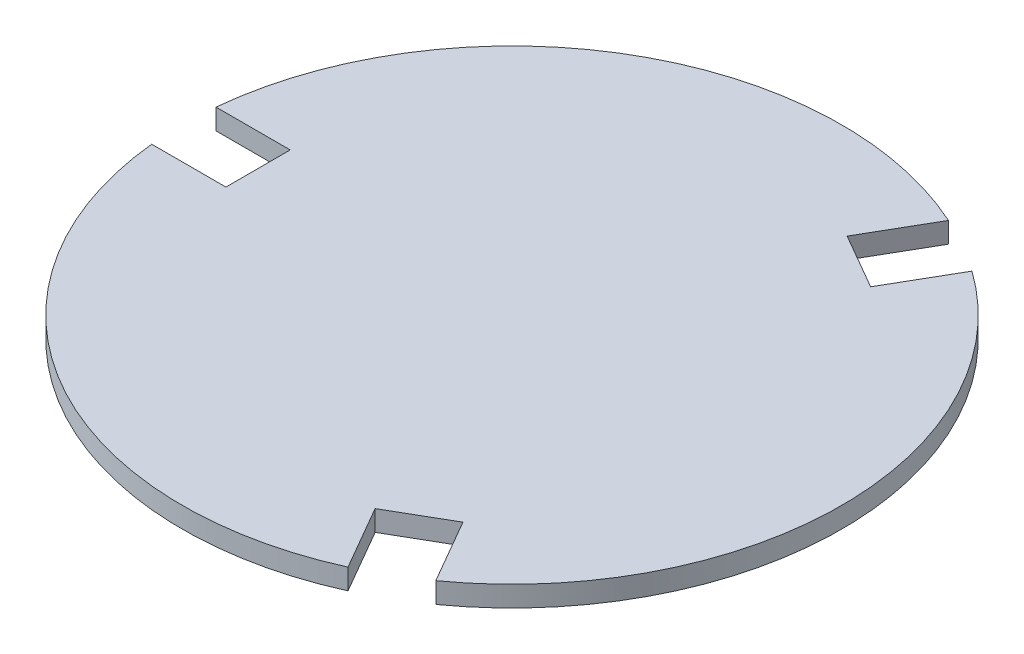
ISO-10303-21;
HEADER;
FILE_DESCRIPTION(('STEP AP214'),'2;1');
FILE_NAME('part.step','',(''),(''),'','','');
FILE_SCHEMA(('AUTOMOTIVE_DESIGN { 1 0 10303 214 1 1 1 1 }'));
ENDSEC;
DATA;
#1=APPLICATION_CONTEXT('core data for automotive mechanical design processes');
#2=APPLICATION_PROTOCOL_DEFINITION('international standard','automotive_design',2000,#1);
#3=PRODUCT_CONTEXT('',#1,'mechanical');
#4=PRODUCT('Part','Part','',(#3));
#5=PRODUCT_RELATED_PRODUCT_CATEGORY('part','',(#4));
#6=PRODUCT_DEFINITION_FORMATION('','',#4);
#7=PRODUCT_DEFINITION_CONTEXT('part definition',#1,'design');
#8=PRODUCT_DEFINITION('design','',#6,#7);
#9=PRODUCT_DEFINITION_SHAPE('','',#8);
#10=(LENGTH_UNIT() NAMED_UNIT(*) SI_UNIT(.MILLI.,.METRE.));
#11=(NAMED_UNIT(*) PLANE_ANGLE_UNIT() SI_UNIT($,.RADIAN.));
#12=(NAMED_UNIT(*) SI_UNIT($,.STERADIAN.) SOLID_ANGLE_UNIT());
#13=UNCERTAINTY_MEASURE_WITH_UNIT(LENGTH_MEASURE(1.E-05),#10,'distance_accuracy_value','');
#14=(GEOMETRIC_REPRESENTATION_CONTEXT(3) GLOBAL_UNCERTAINTY_ASSIGNED_CONTEXT((#13)) GLOBAL_UNIT_ASSIGNED_CONTEXT((#10,
#11,#12)) REPRESENTATION_CONTEXT('',''));
#15=CARTESIAN_POINT('',(0.,0.,0.));
#16=DIRECTION('',(0.,0.,1.));
#17=DIRECTION('',(1.,0.,0.));
#18=AXIS2_PLACEMENT_3D('',#15,#16,#17);
#19=CARTESIAN_POINT('',(0.,3.175,0.));
#20=DIRECTION('',(0.,-1.,0.));
#21=DIRECTION('',(0.,0.,-1.));
#22=AXIS2_PLACEMENT_3D('',#19,#20,#21);
#23=CYLINDRICAL_SURFACE('',#22,50.8);
#24=CARTESIAN_POINT('',(0.,0.,0.));
#25=DIRECTION('',(0.,1.,0.));
#26=DIRECTION('',(0.,0.,1.));
#27=AXIS2_PLACEMENT_3D('',#24,#25,#26);
#28=CIRCLE('',#27,50.8);
#29=CARTESIAN_POINT('',(-50.5579646643336,0.,4.953));
#30=VERTEX_POINT('',#29);
#31=CARTESIAN_POINT('',(20.9895585072227,0.,46.2609817629488));
#32=VERTEX_POINT('',#31);
#33=EDGE_CURVE('E209',#30,#32,#28,.T.);
#34=ORIENTED_EDGE('',*,*,#33,.T.);
#35=DIRECTION('',(0.,-1.,0.));
#36=VECTOR('',#35,1.);
#37=CARTESIAN_POINT('',(20.9895585072227,3.175,46.2609817629488));
#38=LINE('',#37,#36);
#39=CARTESIAN_POINT('',(20.9895585072227,3.175,46.2609817629488));
#40=VERTEX_POINT('',#39);
#41=EDGE_CURVE('E130',#32,#40,#38,.F.);
#42=ORIENTED_EDGE('',*,*,#41,.T.);
#43=CARTESIAN_POINT('',(0.,3.175,0.));
#44=DIRECTION('',(0.,1.,0.));
#45=DIRECTION('',(0.,0.,1.));
#46=AXIS2_PLACEMENT_3D('',#43,#44,#45);
#47=CIRCLE('',#46,50.8);
#48=CARTESIAN_POINT('',(-50.5579646643335,3.175,4.953));
#49=VERTEX_POINT('',#48);
#50=EDGE_CURVE('E203',#49,#40,#47,.T.);
#51=ORIENTED_EDGE('',*,*,#50,.F.);
#52=DIRECTION('',(0.,-1.,0.));
#53=VECTOR('',#52,1.);
#54=CARTESIAN_POINT('',(-50.5579646643336,3.175,4.953));
#55=LINE('',#54,#53);
#56=EDGE_CURVE('E194',#49,#30,#55,.T.);
#57=ORIENTED_EDGE('',*,*,#56,.T.);
#58=EDGE_LOOP('',(#34,#42,#51,#57));
#59=FACE_BOUND('',#58,.T.);
#60=ADVANCED_FACE('F33',(#59),#23,.T.);
#61=CARTESIAN_POINT('',(29.5684061571113,3.175,41.3079817629487));
#62=VERTEX_POINT('',#61);
#63=CARTESIAN_POINT('',(29.5684061571113,3.175,-41.3079817629487));
#64=VERTEX_POINT('',#63);
#65=EDGE_CURVE('E207',#62,#64,#47,.T.);
#66=ORIENTED_EDGE('',*,*,#65,.F.);
#67=DIRECTION('',(0.,-1.,0.));
#68=VECTOR('',#67,1.);
#69=CARTESIAN_POINT('',(29.5684061571113,3.175,41.3079817629487));
#70=LINE('',#69,#68);
#71=CARTESIAN_POINT('',(29.5684061571113,0.,41.3079817629487));
#72=VERTEX_POINT('',#71);
#73=EDGE_CURVE('E140',#62,#72,#70,.T.);
#74=ORIENTED_EDGE('',*,*,#73,.T.);
#75=CARTESIAN_POINT('',(29.5684061571113,0.,-41.3079817629487));
#76=VERTEX_POINT('',#75);
#77=EDGE_CURVE('E211',#72,#76,#28,.T.);
#78=ORIENTED_EDGE('',*,*,#77,.T.);
#79=DIRECTION('',(0.,-1.,0.));
#80=VECTOR('',#79,1.);
#81=CARTESIAN_POINT('',(29.5684061571113,3.175,-41.3079817629487));
#82=LINE('',#81,#80);
#83=EDGE_CURVE('E174',#76,#64,#82,.F.);
#84=ORIENTED_EDGE('',*,*,#83,.T.);
#85=EDGE_LOOP('',(#66,#74,#78,#84));
#86=FACE_BOUND('',#85,.T.);
#87=ADVANCED_FACE('F232',(#86),#23,.T.);
#88=CARTESIAN_POINT('',(20.9895585072227,3.175,-46.2609817629488));
#89=VERTEX_POINT('',#88);
#90=CARTESIAN_POINT('',(-50.5579646643336,3.175,-4.953));
#91=VERTEX_POINT('',#90);
#92=EDGE_CURVE('E208',#89,#91,#47,.T.);
#93=ORIENTED_EDGE('',*,*,#92,.F.);
#94=DIRECTION('',(0.,-1.,0.));
#95=VECTOR('',#94,1.);
#96=CARTESIAN_POINT('',(20.9895585072227,3.175,-46.2609817629487));
#97=LINE('',#96,#95);
#98=CARTESIAN_POINT('',(20.9895585072227,0.,-46.2609817629488));
#99=VERTEX_POINT('',#98);
#100=EDGE_CURVE('E170',#89,#99,#97,.T.);
#101=ORIENTED_EDGE('',*,*,#100,.T.);
#102=CARTESIAN_POINT('',(-50.5579646643336,0.,-4.953));
#103=VERTEX_POINT('',#102);
#104=EDGE_CURVE('E202',#99,#103,#28,.T.);
#105=ORIENTED_EDGE('',*,*,#104,.T.);
#106=DIRECTION('',(0.,-1.,0.));
#107=VECTOR('',#106,1.);
#108=CARTESIAN_POINT('',(-50.5579646643336,3.175,-4.953));
#109=LINE('',#108,#107);
#110=EDGE_CURVE('E199',#103,#91,#109,.F.);
#111=ORIENTED_EDGE('',*,*,#110,.T.);
#112=EDGE_LOOP('',(#93,#101,#105,#111));
#113=FACE_BOUND('',#112,.T.);
#114=ADVANCED_FACE('F35',(#113),#23,.T.);
#115=CARTESIAN_POINT('',(0.,3.175,0.));
#116=DIRECTION('',(0.,1.,0.));
#117=DIRECTION('',(0.,0.,1.));
#118=AXIS2_PLACEMENT_3D('',#115,#116,#117);
#119=PLANE('',#118);
#120=DIRECTION('',(0.500000000000004,0.,0.866025403784436));
#121=VECTOR('',#120,1.);
#122=CARTESIAN_POINT('',(20.9895585072227,3.175,46.2609817629488));
#123=LINE('',#122,#121);
#124=CARTESIAN_POINT('',(15.2745585072226,3.175,36.3623113976926));
#125=VERTEX_POINT('',#124);
#126=EDGE_CURVE('E134',#125,#40,#123,.T.);
#127=ORIENTED_EDGE('',*,*,#126,.F.);
#128=DIRECTION('',(-0.866025403784436,0.,0.500000000000004));
#129=VECTOR('',#128,1.);
#130=CARTESIAN_POINT('',(15.2745585072226,3.175,36.3623113976926));
#131=LINE('',#130,#129);
#132=CARTESIAN_POINT('',(23.8534061571112,3.175,31.4093113976926));
#133=VERTEX_POINT('',#132);
#134=EDGE_CURVE('E138',#133,#125,#131,.T.);
#135=ORIENTED_EDGE('',*,*,#134,.F.);
#136=DIRECTION('',(-0.500000000000004,0.,-0.866025403784436));
#137=VECTOR('',#136,1.);
#138=CARTESIAN_POINT('',(23.8534061571112,3.175,31.4093113976926));
#139=LINE('',#138,#137);
#140=EDGE_CURVE('E148',#62,#133,#139,.T.);
#141=ORIENTED_EDGE('',*,*,#140,.F.);
#142=ORIENTED_EDGE('',*,*,#65,.T.);
#143=DIRECTION('',(0.500000000000004,0.,-0.866025403784436));
#144=VECTOR('',#143,1.);
#145=CARTESIAN_POINT('',(29.5684061571113,3.175,-41.3079817629487));
#146=LINE('',#145,#144);
#147=CARTESIAN_POINT('',(23.8534061571112,3.175,-31.4093113976926));
#148=VERTEX_POINT('',#147);
#149=EDGE_CURVE('E159',#148,#64,#146,.T.);
#150=ORIENTED_EDGE('',*,*,#149,.F.);
#151=DIRECTION('',(0.866025403784436,0.,0.500000000000004));
#152=VECTOR('',#151,1.);
#153=CARTESIAN_POINT('',(23.8534061571112,3.175,-31.4093113976926));
#154=LINE('',#153,#152);
#155=CARTESIAN_POINT('',(15.2745585072226,3.175,-36.3623113976926));
#156=VERTEX_POINT('',#155);
#157=EDGE_CURVE('E163',#156,#148,#154,.T.);
#158=ORIENTED_EDGE('',*,*,#157,.F.);
#159=DIRECTION('',(-0.500000000000004,0.,0.866025403784436));
#160=VECTOR('',#159,1.);
#161=CARTESIAN_POINT('',(15.2745585072226,3.175,-36.3623113976926));
#162=LINE('',#161,#160);
#163=EDGE_CURVE('E155',#89,#156,#162,.T.);
#164=ORIENTED_EDGE('',*,*,#163,.F.);
#165=ORIENTED_EDGE('',*,*,#92,.T.);
#166=DIRECTION('',(-1.,0.,0.));
#167=VECTOR('',#166,1.);
#168=CARTESIAN_POINT('',(-50.5579646643336,3.175,-4.953));
#169=LINE('',#168,#167);
#170=CARTESIAN_POINT('',(-39.1279646643335,3.175,-4.953));
#171=VERTEX_POINT('',#170);
#172=EDGE_CURVE('E182',#171,#91,#169,.T.);
#173=ORIENTED_EDGE('',*,*,#172,.F.);
#174=DIRECTION('',(0.,0.,-1.));
#175=VECTOR('',#174,1.);
#176=CARTESIAN_POINT('',(-39.1279646643335,3.175,-4.953));
#177=LINE('',#176,#175);
#178=CARTESIAN_POINT('',(-39.1279646643335,3.175,4.953));
#179=VERTEX_POINT('',#178);
#180=EDGE_CURVE('E187',#179,#171,#177,.T.);
#181=ORIENTED_EDGE('',*,*,#180,.F.);
#182=DIRECTION('',(1.,0.,0.));
#183=VECTOR('',#182,1.);
#184=CARTESIAN_POINT('',(-39.1279646643335,3.175,4.953));
#185=LINE('',#184,#183);
#186=EDGE_CURVE('E177',#49,#179,#185,.T.);
#187=ORIENTED_EDGE('',*,*,#186,.F.);
#188=ORIENTED_EDGE('',*,*,#50,.T.);
#189=EDGE_LOOP('',(#127,#135,#141,#142,#150,#158,#164,#165,#173,#181,#187,#188));
#190=FACE_BOUND('',#189,.T.);
#191=ADVANCED_FACE('F226',(#190),#119,.T.);
#192=CARTESIAN_POINT('',(0.,0.,0.));
#193=DIRECTION('',(0.,1.,0.));
#194=DIRECTION('',(0.,0.,1.));
#195=AXIS2_PLACEMENT_3D('',#192,#193,#194);
#196=PLANE('',#195);
#197=DIRECTION('',(-0.866025403784436,0.,0.500000000000004));
#198=VECTOR('',#197,1.);
#199=CARTESIAN_POINT('',(15.2745585072226,0.,36.3623113976926));
#200=LINE('',#199,#198);
#201=CARTESIAN_POINT('',(23.8534061571112,0.,31.4093113976926));
#202=VERTEX_POINT('',#201);
#203=CARTESIAN_POINT('',(15.2745585072226,0.,36.3623113976926));
#204=VERTEX_POINT('',#203);
#205=EDGE_CURVE('E48',#202,#204,#200,.T.);
#206=ORIENTED_EDGE('',*,*,#205,.T.);
#207=DIRECTION('',(0.500000000000004,0.,0.866025403784436));
#208=VECTOR('',#207,1.);
#209=CARTESIAN_POINT('',(20.9895585072227,0.,46.2609817629488));
#210=LINE('',#209,#208);
#211=EDGE_CURVE('E125',#204,#32,#210,.T.);
#212=ORIENTED_EDGE('',*,*,#211,.T.);
#213=ORIENTED_EDGE('',*,*,#33,.F.);
#214=DIRECTION('',(1.,0.,0.));
#215=VECTOR('',#214,1.);
#216=CARTESIAN_POINT('',(0.,0.,4.953));
#217=LINE('',#216,#215);
#218=CARTESIAN_POINT('',(-39.1279646643335,0.,4.953));
#219=VERTEX_POINT('',#218);
#220=EDGE_CURVE('E206',#30,#219,#217,.T.);
#221=ORIENTED_EDGE('',*,*,#220,.T.);
#222=DIRECTION('',(0.,0.,-1.));
#223=VECTOR('',#222,1.);
#224=CARTESIAN_POINT('',(-39.1279646643335,0.,-4.953));
#225=LINE('',#224,#223);
#226=CARTESIAN_POINT('',(-39.1279646643335,0.,-4.953));
#227=VERTEX_POINT('',#226);
#228=EDGE_CURVE('E181',#219,#227,#225,.T.);
#229=ORIENTED_EDGE('',*,*,#228,.T.);
#230=DIRECTION('',(-1.,0.,0.));
#231=VECTOR('',#230,1.);
#232=CARTESIAN_POINT('',(-50.5579646643336,0.,-4.953));
#233=LINE('',#232,#231);
#234=EDGE_CURVE('E178',#227,#103,#233,.T.);
#235=ORIENTED_EDGE('',*,*,#234,.T.);
#236=ORIENTED_EDGE('',*,*,#104,.F.);
#237=DIRECTION('',(-0.500000000000004,0.,0.866025403784436));
#238=VECTOR('',#237,1.);
#239=CARTESIAN_POINT('',(-4.28942382494431,0.,-2.47650000000002));
#240=LINE('',#239,#238);
#241=CARTESIAN_POINT('',(15.2745585072226,0.,-36.3623113976926));
#242=VERTEX_POINT('',#241);
#243=EDGE_CURVE('E41',#99,#242,#240,.T.);
#244=ORIENTED_EDGE('',*,*,#243,.T.);
#245=DIRECTION('',(0.866025403784436,0.,0.500000000000004));
#246=VECTOR('',#245,1.);
#247=CARTESIAN_POINT('',(23.8534061571112,0.,-31.4093113976926));
#248=LINE('',#247,#246);
#249=CARTESIAN_POINT('',(23.8534061571112,0.,-31.4093113976926));
#250=VERTEX_POINT('',#249);
#251=EDGE_CURVE('E56',#242,#250,#248,.T.);
#252=ORIENTED_EDGE('',*,*,#251,.T.);
#253=DIRECTION('',(0.500000000000004,0.,-0.866025403784436));
#254=VECTOR('',#253,1.);
#255=CARTESIAN_POINT('',(29.5684061571113,0.,-41.3079817629487));
#256=LINE('',#255,#254);
#257=EDGE_CURVE('E156',#250,#76,#256,.T.);
#258=ORIENTED_EDGE('',*,*,#257,.T.);
#259=ORIENTED_EDGE('',*,*,#77,.F.);
#260=DIRECTION('',(-0.500000000000004,0.,-0.866025403784436));
#261=VECTOR('',#260,1.);
#262=CARTESIAN_POINT('',(4.28942382494432,0.,-2.47650000000002));
#263=LINE('',#262,#261);
#264=EDGE_CURVE('E11',#72,#202,#263,.T.);
#265=ORIENTED_EDGE('',*,*,#264,.T.);
#266=EDGE_LOOP('',(#206,#212,#213,#221,#229,#235,#236,#244,#252,#258,#259,#265));
#267=FACE_BOUND('',#266,.T.);
#268=ADVANCED_FACE('F143',(#267),#196,.F.);
#269=CARTESIAN_POINT('',(-50.5579646643336,0.,-4.953));
#270=DIRECTION('',(0.,0.,-1.));
#271=DIRECTION('',(-1.,0.,0.));
#272=AXIS2_PLACEMENT_3D('',#269,#270,#271);
#273=PLANE('',#272);
#274=ORIENTED_EDGE('',*,*,#234,.F.);
#275=DIRECTION('',(0.,1.,0.));
#276=VECTOR('',#275,1.);
#277=CARTESIAN_POINT('',(-39.1279646643335,0.,-4.953));
#278=LINE('',#277,#276);
#279=EDGE_CURVE('E192',#227,#171,#278,.T.);
#280=ORIENTED_EDGE('',*,*,#279,.T.);
#281=ORIENTED_EDGE('',*,*,#172,.T.);
#282=ORIENTED_EDGE('',*,*,#110,.F.);
#283=EDGE_LOOP('',(#274,#280,#281,#282));
#284=FACE_BOUND('',#283,.T.);
#285=ADVANCED_FACE('F257',(#284),#273,.F.);
#286=CARTESIAN_POINT('',(-39.1279646643335,0.,4.953));
#287=DIRECTION('',(0.,0.,1.));
#288=DIRECTION('',(1.,0.,0.));
#289=AXIS2_PLACEMENT_3D('',#286,#287,#288);
#290=PLANE('',#289);
#291=ORIENTED_EDGE('',*,*,#186,.T.);
#292=DIRECTION('',(0.,1.,0.));
#293=VECTOR('',#292,1.);
#294=CARTESIAN_POINT('',(-39.1279646643335,0.,4.953));
#295=LINE('',#294,#293);
#296=EDGE_CURVE('E185',#219,#179,#295,.T.);
#297=ORIENTED_EDGE('',*,*,#296,.F.);
#298=ORIENTED_EDGE('',*,*,#220,.F.);
#299=ORIENTED_EDGE('',*,*,#56,.F.);
#300=EDGE_LOOP('',(#291,#297,#298,#299));
#301=FACE_BOUND('',#300,.T.);
#302=ADVANCED_FACE('F259',(#301),#290,.F.);
#303=CARTESIAN_POINT('',(-39.1279646643335,0.,-4.953));
#304=DIRECTION('',(1.,0.,0.));
#305=DIRECTION('',(0.,0.,-1.));
#306=AXIS2_PLACEMENT_3D('',#303,#304,#305);
#307=PLANE('',#306);
#308=ORIENTED_EDGE('',*,*,#180,.T.);
#309=ORIENTED_EDGE('',*,*,#279,.F.);
#310=ORIENTED_EDGE('',*,*,#228,.F.);
#311=ORIENTED_EDGE('',*,*,#296,.T.);
#312=EDGE_LOOP('',(#308,#309,#310,#311));
#313=FACE_BOUND('',#312,.T.);
#314=ADVANCED_FACE('F262',(#313),#307,.F.);
#315=CARTESIAN_POINT('',(29.5684061571113,0.,-41.3079817629487));
#316=DIRECTION('',(0.866025403784436,0.,0.500000000000004));
#317=DIRECTION('',(0.500000000000004,0.,-0.866025403784436));
#318=AXIS2_PLACEMENT_3D('',#315,#316,#317);
#319=PLANE('',#318);
#320=ORIENTED_EDGE('',*,*,#257,.F.);
#321=DIRECTION('',(0.,1.,0.));
#322=VECTOR('',#321,1.);
#323=CARTESIAN_POINT('',(23.8534061571112,0.,-31.4093113976926));
#324=LINE('',#323,#322);
#325=EDGE_CURVE('E168',#250,#148,#324,.T.);
#326=ORIENTED_EDGE('',*,*,#325,.T.);
#327=ORIENTED_EDGE('',*,*,#149,.T.);
#328=ORIENTED_EDGE('',*,*,#83,.F.);
#329=EDGE_LOOP('',(#320,#326,#327,#328));
#330=FACE_BOUND('',#329,.T.);
#331=ADVANCED_FACE('F231',(#330),#319,.F.);
#332=CARTESIAN_POINT('',(15.2745585072226,0.,-36.3623113976926));
#333=DIRECTION('',(-0.866025403784436,0.,-0.500000000000004));
#334=DIRECTION('',(-0.500000000000004,0.,0.866025403784436));
#335=AXIS2_PLACEMENT_3D('',#332,#333,#334);
#336=PLANE('',#335);
#337=ORIENTED_EDGE('',*,*,#163,.T.);
#338=DIRECTION('',(0.,1.,0.));
#339=VECTOR('',#338,1.);
#340=CARTESIAN_POINT('',(15.2745585072226,0.,-36.3623113976926));
#341=LINE('',#340,#339);
#342=EDGE_CURVE('E161',#242,#156,#341,.T.);
#343=ORIENTED_EDGE('',*,*,#342,.F.);
#344=ORIENTED_EDGE('',*,*,#243,.F.);
#345=ORIENTED_EDGE('',*,*,#100,.F.);
#346=EDGE_LOOP('',(#337,#343,#344,#345));
#347=FACE_BOUND('',#346,.T.);
#348=ADVANCED_FACE('F216',(#347),#336,.F.);
#349=CARTESIAN_POINT('',(23.8534061571112,0.,-31.4093113976926));
#350=DIRECTION('',(-0.500000000000004,0.,0.866025403784436));
#351=DIRECTION('',(0.866025403784436,0.,0.500000000000004));
#352=AXIS2_PLACEMENT_3D('',#349,#350,#351);
#353=PLANE('',#352);
#354=ORIENTED_EDGE('',*,*,#157,.T.);
#355=ORIENTED_EDGE('',*,*,#325,.F.);
#356=ORIENTED_EDGE('',*,*,#251,.F.);
#357=ORIENTED_EDGE('',*,*,#342,.T.);
#358=EDGE_LOOP('',(#354,#355,#356,#357));
#359=FACE_BOUND('',#358,.T.);
#360=ADVANCED_FACE('F233',(#359),#353,.F.);
#361=CARTESIAN_POINT('',(20.9895585072227,0.,46.2609817629488));
#362=DIRECTION('',(-0.866025403784436,0.,0.500000000000004));
#363=DIRECTION('',(0.500000000000004,0.,0.866025403784436));
#364=AXIS2_PLACEMENT_3D('',#361,#362,#363);
#365=PLANE('',#364);
#366=ORIENTED_EDGE('',*,*,#211,.F.);
#367=DIRECTION('',(0.,1.,0.));
#368=VECTOR('',#367,1.);
#369=CARTESIAN_POINT('',(15.2745585072226,0.,36.3623113976926));
#370=LINE('',#369,#368);
#371=EDGE_CURVE('E127',#204,#125,#370,.T.);
#372=ORIENTED_EDGE('',*,*,#371,.T.);
#373=ORIENTED_EDGE('',*,*,#126,.T.);
#374=ORIENTED_EDGE('',*,*,#41,.F.);
#375=EDGE_LOOP('',(#366,#372,#373,#374));
#376=FACE_BOUND('',#375,.T.);
#377=ADVANCED_FACE('F126',(#376),#365,.F.);
#378=CARTESIAN_POINT('',(23.8534061571112,0.,31.4093113976926));
#379=DIRECTION('',(0.866025403784436,0.,-0.500000000000004));
#380=DIRECTION('',(-0.500000000000004,0.,-0.866025403784436));
#381=AXIS2_PLACEMENT_3D('',#378,#379,#380);
#382=PLANE('',#381);
#383=ORIENTED_EDGE('',*,*,#140,.T.);
#384=DIRECTION('',(0.,1.,0.));
#385=VECTOR('',#384,1.);
#386=CARTESIAN_POINT('',(23.8534061571112,0.,31.4093113976926));
#387=LINE('',#386,#385);
#388=EDGE_CURVE('E141',#202,#133,#387,.T.);
#389=ORIENTED_EDGE('',*,*,#388,.F.);
#390=ORIENTED_EDGE('',*,*,#264,.F.);
#391=ORIENTED_EDGE('',*,*,#73,.F.);
#392=EDGE_LOOP('',(#383,#389,#390,#391));
#393=FACE_BOUND('',#392,.T.);
#394=ADVANCED_FACE('F240',(#393),#382,.F.);
#395=CARTESIAN_POINT('',(15.2745585072226,0.,36.3623113976926));
#396=DIRECTION('',(-0.500000000000004,0.,-0.866025403784436));
#397=DIRECTION('',(-0.866025403784436,0.,0.500000000000004));
#398=AXIS2_PLACEMENT_3D('',#395,#396,#397);
#399=PLANE('',#398);
#400=ORIENTED_EDGE('',*,*,#134,.T.);
#401=ORIENTED_EDGE('',*,*,#371,.F.);
#402=ORIENTED_EDGE('',*,*,#205,.F.);
#403=ORIENTED_EDGE('',*,*,#388,.T.);
#404=EDGE_LOOP('',(#400,#401,#402,#403));
#405=FACE_BOUND('',#404,.T.);
#406=ADVANCED_FACE('F136',(#405),#399,.F.);
#407=CLOSED_SHELL('',(#60,#87,#114,#191,#268,#285,#302,#314,#331,#348,#360,#377,#394,#406));
#408=MANIFOLD_SOLID_BREP('B2',#407);
#409=ADVANCED_BREP_SHAPE_REPRESENTATION('',(#18,#408),#14);
#410=SHAPE_DEFINITION_REPRESENTATION(#9,#409);
ENDSEC;
END-ISO-10303-21;
